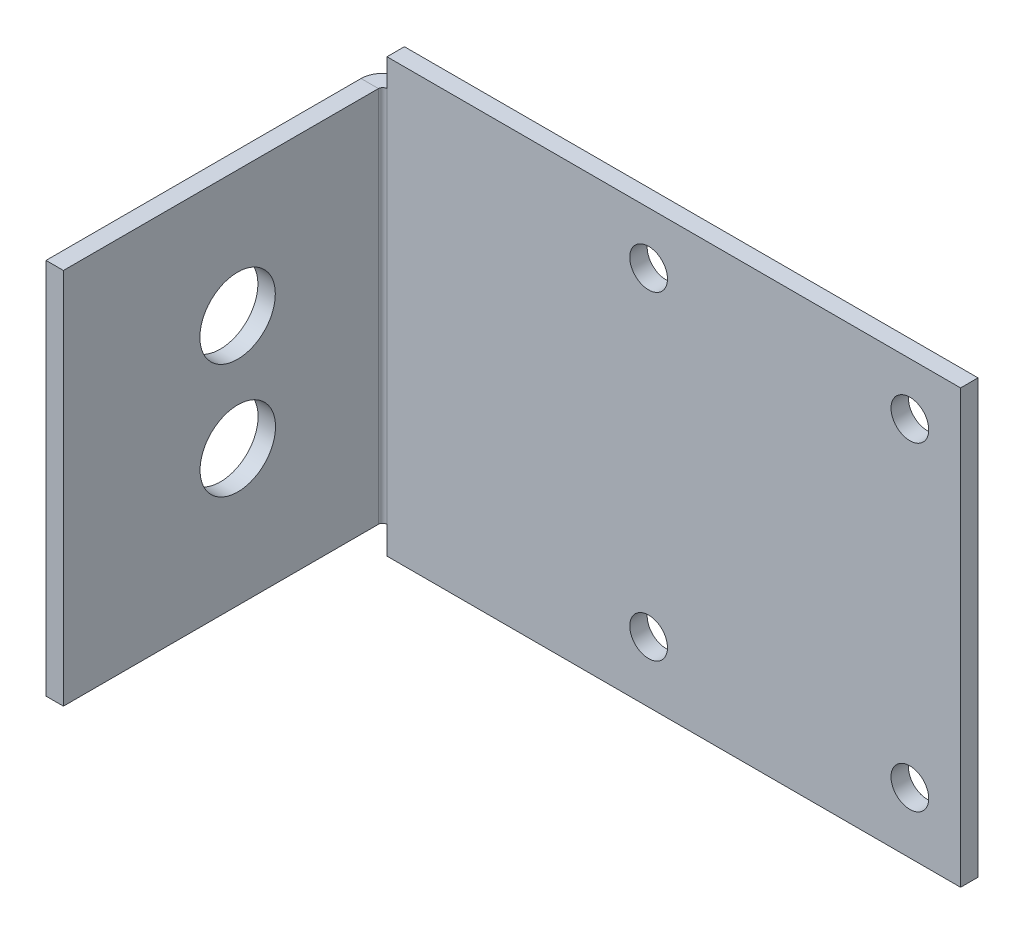
ISO-10303-21;
HEADER;
FILE_DESCRIPTION(('STEP AP214'),'2;1');
FILE_NAME('part.step','',(''),(''),'','','');
FILE_SCHEMA(('AUTOMOTIVE_DESIGN { 1 0 10303 214 1 1 1 1 }'));
ENDSEC;
DATA;
#1=APPLICATION_CONTEXT('core data for automotive mechanical design processes');
#2=APPLICATION_PROTOCOL_DEFINITION('international standard','automotive_design',2000,#1);
#3=PRODUCT_CONTEXT('',#1,'mechanical');
#4=PRODUCT('Part','Part','',(#3));
#5=PRODUCT_RELATED_PRODUCT_CATEGORY('part','',(#4));
#6=PRODUCT_DEFINITION_FORMATION('','',#4);
#7=PRODUCT_DEFINITION_CONTEXT('part definition',#1,'design');
#8=PRODUCT_DEFINITION('design','',#6,#7);
#9=PRODUCT_DEFINITION_SHAPE('','',#8);
#10=(LENGTH_UNIT() NAMED_UNIT(*) SI_UNIT(.MILLI.,.METRE.));
#11=(NAMED_UNIT(*) PLANE_ANGLE_UNIT() SI_UNIT($,.RADIAN.));
#12=(NAMED_UNIT(*) SI_UNIT($,.STERADIAN.) SOLID_ANGLE_UNIT());
#13=UNCERTAINTY_MEASURE_WITH_UNIT(LENGTH_MEASURE(1.E-05),#10,'distance_accuracy_value','');
#14=(GEOMETRIC_REPRESENTATION_CONTEXT(3) GLOBAL_UNCERTAINTY_ASSIGNED_CONTEXT((#13)) GLOBAL_UNIT_ASSIGNED_CONTEXT((#10,
#11,#12)) REPRESENTATION_CONTEXT('',''));
#15=CARTESIAN_POINT('',(0.,0.,0.));
#16=DIRECTION('',(0.,0.,1.));
#17=DIRECTION('',(1.,0.,0.));
#18=AXIS2_PLACEMENT_3D('',#15,#16,#17);
#19=CARTESIAN_POINT('',(-49.4,-37.25,-3.));
#20=DIRECTION('',(-1.,0.,0.));
#21=DIRECTION('',(0.,0.,1.));
#22=AXIS2_PLACEMENT_3D('',#19,#20,#21);
#23=PLANE('',#22);
#24=DIRECTION('',(0.,-1.,0.));
#25=VECTOR('',#24,1.);
#26=CARTESIAN_POINT('',(-49.4,-37.25,0.));
#27=LINE('',#26,#25);
#28=CARTESIAN_POINT('',(-49.4,-32.5,0.));
#29=VERTEX_POINT('',#28);
#30=CARTESIAN_POINT('',(-49.4,-37.25,0.));
#31=VERTEX_POINT('',#30);
#32=EDGE_CURVE('E235',#29,#31,#27,.T.);
#33=ORIENTED_EDGE('',*,*,#32,.F.);
#34=DIRECTION('',(0.,0.,-1.));
#35=VECTOR('',#34,1.);
#36=CARTESIAN_POINT('',(-49.4,-32.5,0.));
#37=LINE('',#36,#35);
#38=CARTESIAN_POINT('',(-49.4,-32.5,-3.));
#39=VERTEX_POINT('',#38);
#40=EDGE_CURVE('E208',#29,#39,#37,.T.);
#41=ORIENTED_EDGE('',*,*,#40,.T.);
#42=DIRECTION('',(0.,-1.,0.));
#43=VECTOR('',#42,1.);
#44=CARTESIAN_POINT('',(-49.4,-37.25,-3.));
#45=LINE('',#44,#43);
#46=CARTESIAN_POINT('',(-49.4,-37.25,-3.));
#47=VERTEX_POINT('',#46);
#48=EDGE_CURVE('E224',#39,#47,#45,.T.);
#49=ORIENTED_EDGE('',*,*,#48,.T.);
#50=DIRECTION('',(0.,0.,1.));
#51=VECTOR('',#50,1.);
#52=CARTESIAN_POINT('',(-49.4,-37.25,-3.));
#53=LINE('',#52,#51);
#54=EDGE_CURVE('E70',#47,#31,#53,.T.);
#55=ORIENTED_EDGE('',*,*,#54,.T.);
#56=EDGE_LOOP('',(#33,#41,#49,#55));
#57=FACE_BOUND('',#56,.T.);
#58=ADVANCED_FACE('F61',(#57),#23,.T.);
#59=CARTESIAN_POINT('',(49.4,-37.25,-3.));
#60=DIRECTION('',(1.,0.,0.));
#61=DIRECTION('',(0.,0.,-1.));
#62=AXIS2_PLACEMENT_3D('',#59,#60,#61);
#63=PLANE('',#62);
#64=DIRECTION('',(0.,1.,0.));
#65=VECTOR('',#64,1.);
#66=CARTESIAN_POINT('',(49.4,-37.25,0.));
#67=LINE('',#66,#65);
#68=CARTESIAN_POINT('',(49.4,-37.25,0.));
#69=VERTEX_POINT('',#68);
#70=CARTESIAN_POINT('',(49.4,37.25,0.));
#71=VERTEX_POINT('',#70);
#72=EDGE_CURVE('E217',#69,#71,#67,.T.);
#73=ORIENTED_EDGE('',*,*,#72,.F.);
#74=DIRECTION('',(0.,0.,1.));
#75=VECTOR('',#74,1.);
#76=CARTESIAN_POINT('',(49.4,-37.25,-3.));
#77=LINE('',#76,#75);
#78=CARTESIAN_POINT('',(49.4,-37.25,-3.));
#79=VERTEX_POINT('',#78);
#80=EDGE_CURVE('E13',#79,#69,#77,.T.);
#81=ORIENTED_EDGE('',*,*,#80,.F.);
#82=DIRECTION('',(0.,1.,0.));
#83=VECTOR('',#82,1.);
#84=CARTESIAN_POINT('',(49.4,-37.25,-3.));
#85=LINE('',#84,#83);
#86=CARTESIAN_POINT('',(49.4,37.25,-3.));
#87=VERTEX_POINT('',#86);
#88=EDGE_CURVE('E219',#79,#87,#85,.T.);
#89=ORIENTED_EDGE('',*,*,#88,.T.);
#90=DIRECTION('',(0.,0.,1.));
#91=VECTOR('',#90,1.);
#92=CARTESIAN_POINT('',(49.4,37.25,-3.));
#93=LINE('',#92,#91);
#94=EDGE_CURVE('E65',#87,#71,#93,.T.);
#95=ORIENTED_EDGE('',*,*,#94,.T.);
#96=EDGE_LOOP('',(#73,#81,#89,#95));
#97=FACE_BOUND('',#96,.T.);
#98=ADVANCED_FACE('F63',(#97),#63,.T.);
#99=CARTESIAN_POINT('',(-49.4,-37.25,-3.));
#100=DIRECTION('',(0.,-1.,0.));
#101=DIRECTION('',(0.,0.,-1.));
#102=AXIS2_PLACEMENT_3D('',#99,#100,#101);
#103=PLANE('',#102);
#104=DIRECTION('',(1.,0.,0.));
#105=VECTOR('',#104,1.);
#106=CARTESIAN_POINT('',(-49.4,-37.25,0.));
#107=LINE('',#106,#105);
#108=EDGE_CURVE('E222',#31,#69,#107,.T.);
#109=ORIENTED_EDGE('',*,*,#108,.F.);
#110=ORIENTED_EDGE('',*,*,#54,.F.);
#111=DIRECTION('',(1.,0.,0.));
#112=VECTOR('',#111,1.);
#113=CARTESIAN_POINT('',(-49.4,-37.25,-3.));
#114=LINE('',#113,#112);
#115=EDGE_CURVE('E228',#47,#79,#114,.T.);
#116=ORIENTED_EDGE('',*,*,#115,.T.);
#117=ORIENTED_EDGE('',*,*,#80,.T.);
#118=EDGE_LOOP('',(#109,#110,#116,#117));
#119=FACE_BOUND('',#118,.T.);
#120=ADVANCED_FACE('F250',(#119),#103,.T.);
#121=DIRECTION('',(0.,0.,-1.));
#122=VECTOR('',#121,1.);
#123=CARTESIAN_POINT('',(-49.4,32.5,0.));
#124=LINE('',#123,#122);
#125=CARTESIAN_POINT('',(-49.4,32.5,0.));
#126=VERTEX_POINT('',#125);
#127=CARTESIAN_POINT('',(-49.4,32.5,-3.));
#128=VERTEX_POINT('',#127);
#129=EDGE_CURVE('E215',#126,#128,#124,.T.);
#130=ORIENTED_EDGE('',*,*,#129,.F.);
#131=CARTESIAN_POINT('',(-49.4,37.25,0.));
#132=VERTEX_POINT('',#131);
#133=EDGE_CURVE('E236',#132,#126,#27,.T.);
#134=ORIENTED_EDGE('',*,*,#133,.F.);
#135=DIRECTION('',(0.,0.,1.));
#136=VECTOR('',#135,1.);
#137=CARTESIAN_POINT('',(-49.4,37.25,-3.));
#138=LINE('',#137,#136);
#139=CARTESIAN_POINT('',(-49.4,37.25,-3.));
#140=VERTEX_POINT('',#139);
#141=EDGE_CURVE('E242',#140,#132,#138,.T.);
#142=ORIENTED_EDGE('',*,*,#141,.F.);
#143=EDGE_CURVE('E225',#140,#128,#45,.T.);
#144=ORIENTED_EDGE('',*,*,#143,.T.);
#145=EDGE_LOOP('',(#130,#134,#142,#144));
#146=FACE_BOUND('',#145,.T.);
#147=ADVANCED_FACE('F259',(#146),#23,.T.);
#148=CARTESIAN_POINT('',(-49.4,37.25,-3.));
#149=DIRECTION('',(0.,1.,0.));
#150=DIRECTION('',(0.,0.,1.));
#151=AXIS2_PLACEMENT_3D('',#148,#149,#150);
#152=PLANE('',#151);
#153=DIRECTION('',(-1.,0.,0.));
#154=VECTOR('',#153,1.);
#155=CARTESIAN_POINT('',(-49.4,37.25,0.));
#156=LINE('',#155,#154);
#157=EDGE_CURVE('E232',#71,#132,#156,.T.);
#158=ORIENTED_EDGE('',*,*,#157,.F.);
#159=ORIENTED_EDGE('',*,*,#94,.F.);
#160=DIRECTION('',(-1.,0.,0.));
#161=VECTOR('',#160,1.);
#162=CARTESIAN_POINT('',(-49.4,37.25,-3.));
#163=LINE('',#162,#161);
#164=EDGE_CURVE('E221',#87,#140,#163,.T.);
#165=ORIENTED_EDGE('',*,*,#164,.T.);
#166=ORIENTED_EDGE('',*,*,#141,.T.);
#167=EDGE_LOOP('',(#158,#159,#165,#166));
#168=FACE_BOUND('',#167,.T.);
#169=ADVANCED_FACE('F244',(#168),#152,.T.);
#170=CARTESIAN_POINT('',(0.,0.,-3.));
#171=DIRECTION('',(0.,0.,-1.));
#172=DIRECTION('',(-1.,0.,0.));
#173=AXIS2_PLACEMENT_3D('',#170,#171,#172);
#174=PLANE('',#173);
#175=CARTESIAN_POINT('',(40.6634000000001,28.25,-3.));
#176=DIRECTION('',(0.,0.,-1.));
#177=DIRECTION('',(-1.,0.,0.));
#178=AXIS2_PLACEMENT_3D('',#175,#176,#177);
#179=CIRCLE('',#178,3.25);
#180=CARTESIAN_POINT('',(37.4134000000001,28.25,-3.));
#181=VERTEX_POINT('',#180);
#182=EDGE_CURVE('E205',#181,#181,#179,.T.);
#183=ORIENTED_EDGE('',*,*,#182,.F.);
#184=EDGE_LOOP('',(#183));
#185=FACE_BOUND('',#184,.T.);
#186=CARTESIAN_POINT('',(-4.33659999999989,28.25,-3.));
#187=DIRECTION('',(0.,0.,-1.));
#188=DIRECTION('',(-1.,0.,0.));
#189=AXIS2_PLACEMENT_3D('',#186,#187,#188);
#190=CIRCLE('',#189,3.25);
#191=CARTESIAN_POINT('',(-7.5865999999999,28.25,-3.));
#192=VERTEX_POINT('',#191);
#193=EDGE_CURVE('E282',#192,#192,#190,.T.);
#194=ORIENTED_EDGE('',*,*,#193,.F.);
#195=EDGE_LOOP('',(#194));
#196=FACE_BOUND('',#195,.T.);
#197=CARTESIAN_POINT('',(-4.33659999999989,-26.75,-3.));
#198=DIRECTION('',(0.,0.,-1.));
#199=DIRECTION('',(-1.,0.,0.));
#200=AXIS2_PLACEMENT_3D('',#197,#198,#199);
#201=CIRCLE('',#200,3.25);
#202=CARTESIAN_POINT('',(-7.58659999999989,-26.75,-3.));
#203=VERTEX_POINT('',#202);
#204=EDGE_CURVE('E285',#203,#203,#201,.T.);
#205=ORIENTED_EDGE('',*,*,#204,.F.);
#206=EDGE_LOOP('',(#205));
#207=FACE_BOUND('',#206,.T.);
#208=CARTESIAN_POINT('',(40.6634000000001,-26.75,-3.));
#209=DIRECTION('',(0.,0.,-1.));
#210=DIRECTION('',(-1.,0.,0.));
#211=AXIS2_PLACEMENT_3D('',#208,#209,#210);
#212=CIRCLE('',#211,3.25);
#213=CARTESIAN_POINT('',(37.4134000000001,-26.75,-3.));
#214=VERTEX_POINT('',#213);
#215=EDGE_CURVE('E288',#214,#214,#212,.T.);
#216=ORIENTED_EDGE('',*,*,#215,.F.);
#217=EDGE_LOOP('',(#216));
#218=FACE_BOUND('',#217,.T.);
#219=ORIENTED_EDGE('',*,*,#88,.F.);
#220=ORIENTED_EDGE('',*,*,#115,.F.);
#221=ORIENTED_EDGE('',*,*,#48,.F.);
#222=DIRECTION('',(0.,-1.,0.));
#223=VECTOR('',#222,1.);
#224=CARTESIAN_POINT('',(-49.4,-32.5,-3.));
#225=LINE('',#224,#223);
#226=EDGE_CURVE('E150',#39,#128,#225,.F.);
#227=ORIENTED_EDGE('',*,*,#226,.T.);
#228=ORIENTED_EDGE('',*,*,#143,.F.);
#229=ORIENTED_EDGE('',*,*,#164,.F.);
#230=EDGE_LOOP('',(#219,#220,#221,#227,#228,#229));
#231=FACE_BOUND('',#230,.T.);
#232=ADVANCED_FACE('F255',(#185,#196,#207,#218,#231),#174,.T.);
#233=CARTESIAN_POINT('',(0.,0.,0.));
#234=DIRECTION('',(0.,0.,-1.));
#235=DIRECTION('',(-1.,0.,0.));
#236=AXIS2_PLACEMENT_3D('',#233,#234,#235);
#237=PLANE('',#236);
#238=CARTESIAN_POINT('',(40.6634000000001,28.25,0.));
#239=DIRECTION('',(0.,0.,1.));
#240=DIRECTION('',(1.,0.,0.));
#241=AXIS2_PLACEMENT_3D('',#238,#239,#240);
#242=CIRCLE('',#241,3.25);
#243=CARTESIAN_POINT('',(43.9134000000001,28.25,0.));
#244=VERTEX_POINT('',#243);
#245=EDGE_CURVE('E295',#244,#244,#242,.T.);
#246=ORIENTED_EDGE('',*,*,#245,.F.);
#247=EDGE_LOOP('',(#246));
#248=FACE_BOUND('',#247,.T.);
#249=CARTESIAN_POINT('',(-4.33659999999989,28.25,0.));
#250=DIRECTION('',(0.,0.,1.));
#251=DIRECTION('',(1.,0.,0.));
#252=AXIS2_PLACEMENT_3D('',#249,#250,#251);
#253=CIRCLE('',#252,3.25);
#254=CARTESIAN_POINT('',(-1.08659999999989,28.25,0.));
#255=VERTEX_POINT('',#254);
#256=EDGE_CURVE('E298',#255,#255,#253,.T.);
#257=ORIENTED_EDGE('',*,*,#256,.F.);
#258=EDGE_LOOP('',(#257));
#259=FACE_BOUND('',#258,.T.);
#260=CARTESIAN_POINT('',(-4.33659999999989,-26.75,0.));
#261=DIRECTION('',(0.,0.,1.));
#262=DIRECTION('',(1.,0.,0.));
#263=AXIS2_PLACEMENT_3D('',#260,#261,#262);
#264=CIRCLE('',#263,3.25);
#265=CARTESIAN_POINT('',(-1.08659999999989,-26.75,0.));
#266=VERTEX_POINT('',#265);
#267=EDGE_CURVE('E294',#266,#266,#264,.T.);
#268=ORIENTED_EDGE('',*,*,#267,.F.);
#269=EDGE_LOOP('',(#268));
#270=FACE_BOUND('',#269,.T.);
#271=CARTESIAN_POINT('',(40.6634000000001,-26.75,0.));
#272=DIRECTION('',(0.,0.,1.));
#273=DIRECTION('',(1.,0.,0.));
#274=AXIS2_PLACEMENT_3D('',#271,#272,#273);
#275=CIRCLE('',#274,3.25);
#276=CARTESIAN_POINT('',(43.9134000000001,-26.75,0.));
#277=VERTEX_POINT('',#276);
#278=EDGE_CURVE('E291',#277,#277,#275,.T.);
#279=ORIENTED_EDGE('',*,*,#278,.F.);
#280=EDGE_LOOP('',(#279));
#281=FACE_BOUND('',#280,.T.);
#282=ORIENTED_EDGE('',*,*,#72,.T.);
#283=ORIENTED_EDGE('',*,*,#157,.T.);
#284=ORIENTED_EDGE('',*,*,#133,.T.);
#285=DIRECTION('',(0.,-1.,0.));
#286=VECTOR('',#285,1.);
#287=CARTESIAN_POINT('',(-49.4,-32.5,0.));
#288=LINE('',#287,#286);
#289=EDGE_CURVE('E212',#29,#126,#288,.F.);
#290=ORIENTED_EDGE('',*,*,#289,.F.);
#291=ORIENTED_EDGE('',*,*,#32,.T.);
#292=ORIENTED_EDGE('',*,*,#108,.T.);
#293=EDGE_LOOP('',(#282,#283,#284,#290,#291,#292));
#294=FACE_BOUND('',#293,.T.);
#295=ADVANCED_FACE('F246',(#248,#259,#270,#281,#294),#237,.F.);
#296=CARTESIAN_POINT('',(-49.4,32.5,0.7366));
#297=DIRECTION('',(0.,1.,0.));
#298=DIRECTION('',(0.,0.,1.));
#299=AXIS2_PLACEMENT_3D('',#296,#297,#298);
#300=PLANE('',#299);
#301=DIRECTION('',(1.,0.,0.));
#302=VECTOR('',#301,1.);
#303=CARTESIAN_POINT('',(-53.1366,32.5,0.736599999999986));
#304=LINE('',#303,#302);
#305=CARTESIAN_POINT('',(-50.1366,32.5,0.736599999999997));
#306=VERTEX_POINT('',#305);
#307=CARTESIAN_POINT('',(-53.1366,32.5,0.736599999999986));
#308=VERTEX_POINT('',#307);
#309=EDGE_CURVE('E202',#306,#308,#304,.F.);
#310=ORIENTED_EDGE('',*,*,#309,.F.);
#311=CARTESIAN_POINT('',(-49.4,32.5,0.7366));
#312=DIRECTION('',(0.,-1.,0.));
#313=DIRECTION('',(0.,0.,-1.));
#314=AXIS2_PLACEMENT_3D('',#311,#312,#313);
#315=CIRCLE('',#314,0.736599999999997);
#316=EDGE_CURVE('E152',#126,#306,#315,.F.);
#317=ORIENTED_EDGE('',*,*,#316,.F.);
#318=ORIENTED_EDGE('',*,*,#129,.T.);
#319=CARTESIAN_POINT('',(-49.4,32.5,0.7366));
#320=DIRECTION('',(0.,-1.,0.));
#321=DIRECTION('',(0.,0.,-1.));
#322=AXIS2_PLACEMENT_3D('',#319,#320,#321);
#323=CIRCLE('',#322,3.7366);
#324=EDGE_CURVE('E207',#128,#308,#323,.F.);
#325=ORIENTED_EDGE('',*,*,#324,.T.);
#326=EDGE_LOOP('',(#310,#317,#318,#325));
#327=FACE_BOUND('',#326,.T.);
#328=ADVANCED_FACE('F264',(#327),#300,.T.);
#329=CARTESIAN_POINT('',(-49.4,-32.5,0.7366));
#330=DIRECTION('',(0.,1.,0.));
#331=DIRECTION('',(0.,0.,1.));
#332=AXIS2_PLACEMENT_3D('',#329,#330,#331);
#333=PLANE('',#332);
#334=CARTESIAN_POINT('',(-49.4,-32.5,0.7366));
#335=DIRECTION('',(0.,-1.,0.));
#336=DIRECTION('',(0.,0.,-1.));
#337=AXIS2_PLACEMENT_3D('',#334,#335,#336);
#338=CIRCLE('',#337,0.736599999999997);
#339=CARTESIAN_POINT('',(-50.1366,-32.5,0.736599999999997));
#340=VERTEX_POINT('',#339);
#341=EDGE_CURVE('E159',#340,#29,#338,.T.);
#342=ORIENTED_EDGE('',*,*,#341,.F.);
#343=DIRECTION('',(1.,0.,0.));
#344=VECTOR('',#343,1.);
#345=CARTESIAN_POINT('',(-50.1366,-32.5,0.736599999999997));
#346=LINE('',#345,#344);
#347=CARTESIAN_POINT('',(-53.1366,-32.5,0.736599999999986));
#348=VERTEX_POINT('',#347);
#349=EDGE_CURVE('E156',#340,#348,#346,.F.);
#350=ORIENTED_EDGE('',*,*,#349,.T.);
#351=CARTESIAN_POINT('',(-49.4,-32.5,0.7366));
#352=DIRECTION('',(0.,-1.,0.));
#353=DIRECTION('',(0.,0.,-1.));
#354=AXIS2_PLACEMENT_3D('',#351,#352,#353);
#355=CIRCLE('',#354,3.7366);
#356=EDGE_CURVE('E78',#348,#39,#355,.T.);
#357=ORIENTED_EDGE('',*,*,#356,.T.);
#358=ORIENTED_EDGE('',*,*,#40,.F.);
#359=EDGE_LOOP('',(#342,#350,#357,#358));
#360=FACE_BOUND('',#359,.T.);
#361=ADVANCED_FACE('F157',(#360),#333,.F.);
#362=CARTESIAN_POINT('',(-49.4,-32.5,0.7366));
#363=DIRECTION('',(0.,-1.,0.));
#364=DIRECTION('',(-1.,0.,0.));
#365=AXIS2_PLACEMENT_3D('',#362,#363,#364);
#366=CYLINDRICAL_SURFACE('',#365,3.7366);
#367=ORIENTED_EDGE('',*,*,#226,.F.);
#368=ORIENTED_EDGE('',*,*,#356,.F.);
#369=DIRECTION('',(0.,-1.,0.));
#370=VECTOR('',#369,1.);
#371=CARTESIAN_POINT('',(-53.1366,32.5,0.736599999999986));
#372=LINE('',#371,#370);
#373=EDGE_CURVE('E147',#348,#308,#372,.F.);
#374=ORIENTED_EDGE('',*,*,#373,.T.);
#375=ORIENTED_EDGE('',*,*,#324,.F.);
#376=EDGE_LOOP('',(#367,#368,#374,#375));
#377=FACE_BOUND('',#376,.T.);
#378=ADVANCED_FACE('F144',(#377),#366,.T.);
#379=CARTESIAN_POINT('',(-49.4,-32.5,0.7366));
#380=DIRECTION('',(0.,-1.,0.));
#381=DIRECTION('',(-1.,0.,0.));
#382=AXIS2_PLACEMENT_3D('',#379,#380,#381);
#383=CYLINDRICAL_SURFACE('',#382,0.736599999999997);
#384=ORIENTED_EDGE('',*,*,#289,.T.);
#385=ORIENTED_EDGE('',*,*,#316,.T.);
#386=DIRECTION('',(0.,-1.,0.));
#387=VECTOR('',#386,1.);
#388=CARTESIAN_POINT('',(-50.1366,32.5,0.736599999999997));
#389=LINE('',#388,#387);
#390=EDGE_CURVE('E163',#306,#340,#389,.T.);
#391=ORIENTED_EDGE('',*,*,#390,.T.);
#392=ORIENTED_EDGE('',*,*,#341,.T.);
#393=EDGE_LOOP('',(#384,#385,#391,#392));
#394=FACE_BOUND('',#393,.T.);
#395=ADVANCED_FACE('F262',(#394),#383,.F.);
#396=CARTESIAN_POINT('',(-53.1366,0.,-1.84981317614429E-13));
#397=DIRECTION('',(1.,0.,0.));
#398=DIRECTION('',(0.,0.,-1.));
#399=AXIS2_PLACEMENT_3D('',#396,#397,#398);
#400=PLANE('',#399);
#401=CARTESIAN_POINT('',(-53.1366000000001,-9.05762339257835,24.9667877553995));
#402=DIRECTION('',(1.,0.,0.));
#403=DIRECTION('',(0.,0.,-1.));
#404=AXIS2_PLACEMENT_3D('',#401,#402,#403);
#405=CIRCLE('',#404,6.5);
#406=CARTESIAN_POINT('',(-53.1366000000001,-9.05762339257835,18.4667877553995));
#407=VERTEX_POINT('',#406);
#408=EDGE_CURVE('E196',#407,#407,#405,.F.);
#409=ORIENTED_EDGE('',*,*,#408,.F.);
#410=EDGE_LOOP('',(#409));
#411=FACE_BOUND('',#410,.T.);
#412=CARTESIAN_POINT('',(-53.1366000000001,10.7500000000141,24.9999999999888));
#413=DIRECTION('',(1.,0.,0.));
#414=DIRECTION('',(0.,0.,-1.));
#415=AXIS2_PLACEMENT_3D('',#412,#413,#414);
#416=CIRCLE('',#415,6.5);
#417=CARTESIAN_POINT('',(-53.1366000000001,10.7500000000141,18.4999999999888));
#418=VERTEX_POINT('',#417);
#419=EDGE_CURVE('E190',#418,#418,#416,.F.);
#420=ORIENTED_EDGE('',*,*,#419,.F.);
#421=EDGE_LOOP('',(#420));
#422=FACE_BOUND('',#421,.T.);
#423=ORIENTED_EDGE('',*,*,#373,.F.);
#424=DIRECTION('',(0.,0.,1.));
#425=VECTOR('',#424,1.);
#426=CARTESIAN_POINT('',(-53.1366,-32.5,-1.80881062125757E-13));
#427=LINE('',#426,#425);
#428=CARTESIAN_POINT('',(-53.1366000000002,-32.5,55.));
#429=VERTEX_POINT('',#428);
#430=EDGE_CURVE('E168',#348,#429,#427,.T.);
#431=ORIENTED_EDGE('',*,*,#430,.T.);
#432=DIRECTION('',(0.,1.,0.));
#433=VECTOR('',#432,1.);
#434=CARTESIAN_POINT('',(-53.1366000000002,0.,55.));
#435=LINE('',#434,#433);
#436=CARTESIAN_POINT('',(-53.1366000000002,32.5,55.));
#437=VERTEX_POINT('',#436);
#438=EDGE_CURVE('E178',#429,#437,#435,.T.);
#439=ORIENTED_EDGE('',*,*,#438,.T.);
#440=DIRECTION('',(0.,0.,-1.));
#441=VECTOR('',#440,1.);
#442=CARTESIAN_POINT('',(-53.1366,32.5,-1.84981317614429E-13));
#443=LINE('',#442,#441);
#444=EDGE_CURVE('E171',#437,#308,#443,.T.);
#445=ORIENTED_EDGE('',*,*,#444,.T.);
#446=EDGE_LOOP('',(#423,#431,#439,#445));
#447=FACE_BOUND('',#446,.T.);
#448=ADVANCED_FACE('F167',(#411,#422,#447),#400,.F.);
#449=CARTESIAN_POINT('',(-50.1366,0.,-1.745068735979E-13));
#450=DIRECTION('',(1.,0.,0.));
#451=DIRECTION('',(0.,0.,-1.));
#452=AXIS2_PLACEMENT_3D('',#449,#450,#451);
#453=PLANE('',#452);
#454=CARTESIAN_POINT('',(-50.1366000000001,10.7500000000141,24.9999999999888));
#455=DIRECTION('',(1.,0.,0.));
#456=DIRECTION('',(0.,0.,-1.));
#457=AXIS2_PLACEMENT_3D('',#454,#455,#456);
#458=CIRCLE('',#457,6.5);
#459=CARTESIAN_POINT('',(-50.1366000000001,10.7500000000141,18.4999999999888));
#460=VERTEX_POINT('',#459);
#461=EDGE_CURVE('E193',#460,#460,#458,.F.);
#462=ORIENTED_EDGE('',*,*,#461,.T.);
#463=EDGE_LOOP('',(#462));
#464=FACE_BOUND('',#463,.T.);
#465=CARTESIAN_POINT('',(-50.1366000000001,-9.05762339257835,24.9667877553995));
#466=DIRECTION('',(1.,0.,0.));
#467=DIRECTION('',(0.,0.,-1.));
#468=AXIS2_PLACEMENT_3D('',#465,#466,#467);
#469=CIRCLE('',#468,6.5);
#470=CARTESIAN_POINT('',(-50.1366000000001,-9.05762339257835,18.4667877553995));
#471=VERTEX_POINT('',#470);
#472=EDGE_CURVE('E172',#471,#471,#469,.F.);
#473=ORIENTED_EDGE('',*,*,#472,.T.);
#474=EDGE_LOOP('',(#473));
#475=FACE_BOUND('',#474,.T.);
#476=DIRECTION('',(0.,0.,-1.));
#477=VECTOR('',#476,1.);
#478=CARTESIAN_POINT('',(-50.1366000000002,-32.5,55.));
#479=LINE('',#478,#477);
#480=CARTESIAN_POINT('',(-50.1366000000002,-32.5,55.));
#481=VERTEX_POINT('',#480);
#482=EDGE_CURVE('E188',#340,#481,#479,.F.);
#483=ORIENTED_EDGE('',*,*,#482,.F.);
#484=ORIENTED_EDGE('',*,*,#390,.F.);
#485=DIRECTION('',(0.,0.,1.));
#486=VECTOR('',#485,1.);
#487=CARTESIAN_POINT('',(-50.1366,32.5,0.));
#488=LINE('',#487,#486);
#489=CARTESIAN_POINT('',(-50.1366000000002,32.5,55.));
#490=VERTEX_POINT('',#489);
#491=EDGE_CURVE('E179',#490,#306,#488,.F.);
#492=ORIENTED_EDGE('',*,*,#491,.F.);
#493=DIRECTION('',(0.,-1.,0.));
#494=VECTOR('',#493,1.);
#495=CARTESIAN_POINT('',(-50.1366000000002,32.5,55.));
#496=LINE('',#495,#494);
#497=EDGE_CURVE('E183',#481,#490,#496,.F.);
#498=ORIENTED_EDGE('',*,*,#497,.F.);
#499=EDGE_LOOP('',(#483,#484,#492,#498));
#500=FACE_BOUND('',#499,.T.);
#501=ADVANCED_FACE('F274',(#464,#475,#500),#453,.T.);
#502=CARTESIAN_POINT('',(-53.1366000000002,-32.5,55.));
#503=DIRECTION('',(0.,1.,0.));
#504=DIRECTION('',(0.,0.,1.));
#505=AXIS2_PLACEMENT_3D('',#502,#503,#504);
#506=PLANE('',#505);
#507=ORIENTED_EDGE('',*,*,#349,.F.);
#508=ORIENTED_EDGE('',*,*,#482,.T.);
#509=DIRECTION('',(1.,0.,0.));
#510=VECTOR('',#509,1.);
#511=CARTESIAN_POINT('',(-53.1366000000002,-32.5,55.));
#512=LINE('',#511,#510);
#513=EDGE_CURVE('E176',#429,#481,#512,.T.);
#514=ORIENTED_EDGE('',*,*,#513,.F.);
#515=ORIENTED_EDGE('',*,*,#430,.F.);
#516=EDGE_LOOP('',(#507,#508,#514,#515));
#517=FACE_BOUND('',#516,.T.);
#518=ADVANCED_FACE('F174',(#517),#506,.F.);
#519=CARTESIAN_POINT('',(-53.1366,32.5,0.));
#520=DIRECTION('',(0.,-1.,0.));
#521=DIRECTION('',(0.,0.,-1.));
#522=AXIS2_PLACEMENT_3D('',#519,#520,#521);
#523=PLANE('',#522);
#524=ORIENTED_EDGE('',*,*,#309,.T.);
#525=ORIENTED_EDGE('',*,*,#444,.F.);
#526=DIRECTION('',(1.,0.,0.));
#527=VECTOR('',#526,1.);
#528=CARTESIAN_POINT('',(-53.1366000000002,32.5,55.));
#529=LINE('',#528,#527);
#530=EDGE_CURVE('E271',#437,#490,#529,.T.);
#531=ORIENTED_EDGE('',*,*,#530,.T.);
#532=ORIENTED_EDGE('',*,*,#491,.T.);
#533=EDGE_LOOP('',(#524,#525,#531,#532));
#534=FACE_BOUND('',#533,.T.);
#535=ADVANCED_FACE('F266',(#534),#523,.F.);
#536=CARTESIAN_POINT('',(-53.1366000000002,32.5,55.));
#537=DIRECTION('',(0.,0.,-1.));
#538=DIRECTION('',(-1.,0.,0.));
#539=AXIS2_PLACEMENT_3D('',#536,#537,#538);
#540=PLANE('',#539);
#541=ORIENTED_EDGE('',*,*,#497,.T.);
#542=ORIENTED_EDGE('',*,*,#530,.F.);
#543=ORIENTED_EDGE('',*,*,#438,.F.);
#544=ORIENTED_EDGE('',*,*,#513,.T.);
#545=EDGE_LOOP('',(#541,#542,#543,#544));
#546=FACE_BOUND('',#545,.T.);
#547=ADVANCED_FACE('F276',(#546),#540,.F.);
#548=CARTESIAN_POINT('',(-53.1366000000001,10.7500000000141,24.9999999999888));
#549=DIRECTION('',(1.,0.,0.));
#550=DIRECTION('',(0.,0.,-1.));
#551=AXIS2_PLACEMENT_3D('',#548,#549,#550);
#552=CYLINDRICAL_SURFACE('',#551,6.5);
#553=ORIENTED_EDGE('',*,*,#419,.T.);
#554=EDGE_LOOP('',(#553));
#555=FACE_BOUND('',#554,.T.);
#556=ORIENTED_EDGE('',*,*,#461,.F.);
#557=EDGE_LOOP('',(#556));
#558=FACE_BOUND('',#557,.T.);
#559=ADVANCED_FACE('F324',(#555,#558),#552,.F.);
#560=CARTESIAN_POINT('',(-53.1366000000001,-9.05762339257835,24.9667877553995));
#561=DIRECTION('',(1.,0.,0.));
#562=DIRECTION('',(0.,0.,-1.));
#563=AXIS2_PLACEMENT_3D('',#560,#561,#562);
#564=CYLINDRICAL_SURFACE('',#563,6.5);
#565=ORIENTED_EDGE('',*,*,#408,.T.);
#566=EDGE_LOOP('',(#565));
#567=FACE_BOUND('',#566,.T.);
#568=ORIENTED_EDGE('',*,*,#472,.F.);
#569=EDGE_LOOP('',(#568));
#570=FACE_BOUND('',#569,.T.);
#571=ADVANCED_FACE('F314',(#567,#570),#564,.F.);
#572=CARTESIAN_POINT('',(40.6634000000001,-26.75,-10.));
#573=DIRECTION('',(0.,0.,1.));
#574=DIRECTION('',(1.,0.,0.));
#575=AXIS2_PLACEMENT_3D('',#572,#573,#574);
#576=CYLINDRICAL_SURFACE('',#575,3.25);
#577=ORIENTED_EDGE('',*,*,#215,.T.);
#578=EDGE_LOOP('',(#577));
#579=FACE_BOUND('',#578,.T.);
#580=ORIENTED_EDGE('',*,*,#278,.T.);
#581=EDGE_LOOP('',(#580));
#582=FACE_BOUND('',#581,.T.);
#583=ADVANCED_FACE('F312',(#579,#582),#576,.F.);
#584=CARTESIAN_POINT('',(-4.33659999999989,-26.75,-10.));
#585=DIRECTION('',(0.,0.,1.));
#586=DIRECTION('',(1.,0.,0.));
#587=AXIS2_PLACEMENT_3D('',#584,#585,#586);
#588=CYLINDRICAL_SURFACE('',#587,3.25);
#589=ORIENTED_EDGE('',*,*,#204,.T.);
#590=EDGE_LOOP('',(#589));
#591=FACE_BOUND('',#590,.T.);
#592=ORIENTED_EDGE('',*,*,#267,.T.);
#593=EDGE_LOOP('',(#592));
#594=FACE_BOUND('',#593,.T.);
#595=ADVANCED_FACE('F304',(#591,#594),#588,.F.);
#596=CARTESIAN_POINT('',(-4.33659999999989,28.25,-10.));
#597=DIRECTION('',(0.,0.,1.));
#598=DIRECTION('',(1.,0.,0.));
#599=AXIS2_PLACEMENT_3D('',#596,#597,#598);
#600=CYLINDRICAL_SURFACE('',#599,3.25);
#601=ORIENTED_EDGE('',*,*,#193,.T.);
#602=EDGE_LOOP('',(#601));
#603=FACE_BOUND('',#602,.T.);
#604=ORIENTED_EDGE('',*,*,#256,.T.);
#605=EDGE_LOOP('',(#604));
#606=FACE_BOUND('',#605,.T.);
#607=ADVANCED_FACE('F321',(#603,#606),#600,.F.);
#608=CARTESIAN_POINT('',(40.6634000000001,28.25,-10.));
#609=DIRECTION('',(0.,0.,1.));
#610=DIRECTION('',(1.,0.,0.));
#611=AXIS2_PLACEMENT_3D('',#608,#609,#610);
#612=CYLINDRICAL_SURFACE('',#611,3.25);
#613=ORIENTED_EDGE('',*,*,#182,.T.);
#614=EDGE_LOOP('',(#613));
#615=FACE_BOUND('',#614,.T.);
#616=ORIENTED_EDGE('',*,*,#245,.T.);
#617=EDGE_LOOP('',(#616));
#618=FACE_BOUND('',#617,.T.);
#619=ADVANCED_FACE('F420',(#615,#618),#612,.F.);
#620=CLOSED_SHELL('',(#58,#98,#120,#147,#169,#232,#295,#328,#361,#378,#395,#448,#501,#518,#535,
#547,#559,#571,#583,#595,#607,#619));
#621=MANIFOLD_SOLID_BREP('B2',#620);
#622=ADVANCED_BREP_SHAPE_REPRESENTATION('',(#18,#621),#14);
#623=SHAPE_DEFINITION_REPRESENTATION(#9,#622);
ENDSEC;
END-ISO-10303-21;
